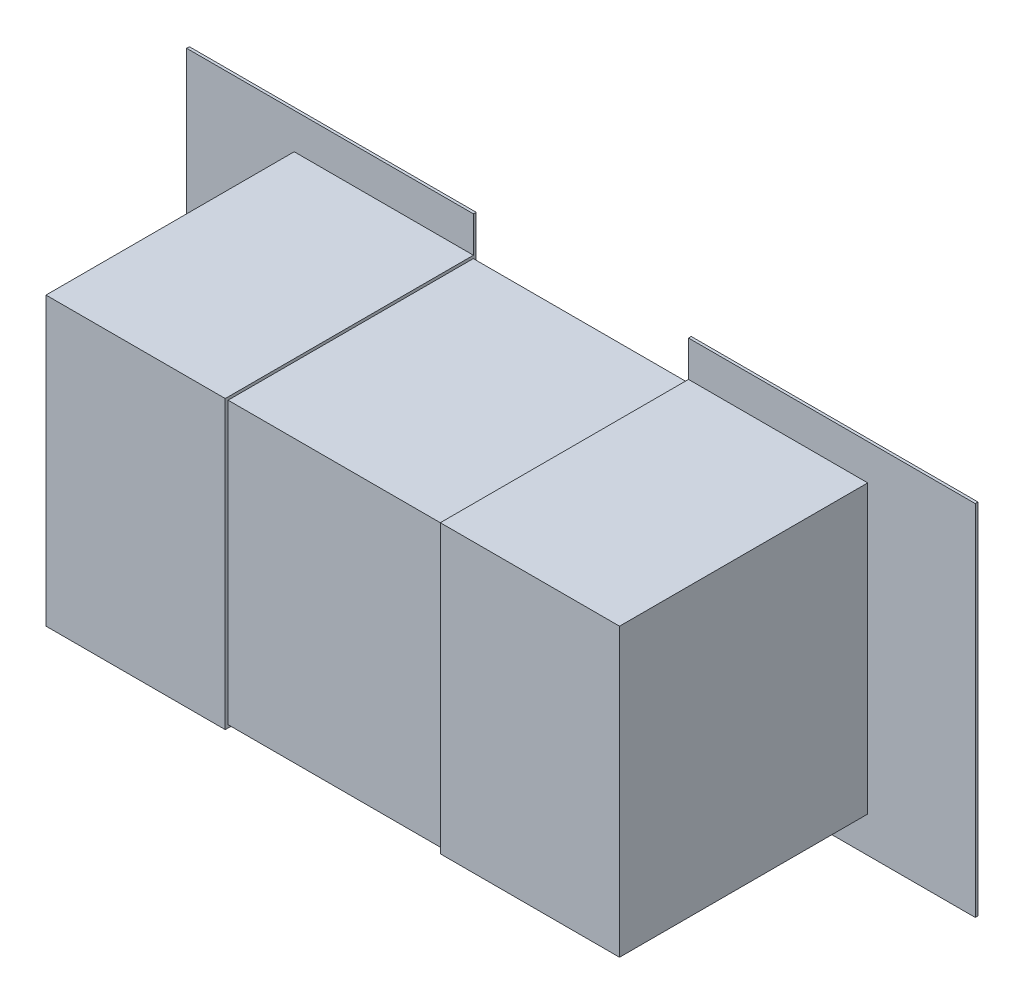
ISO-10303-21;
HEADER;
FILE_DESCRIPTION(('STEP AP214'),'2;1');
FILE_NAME('part.step','',(''),(''),'','','');
FILE_SCHEMA(('AUTOMOTIVE_DESIGN { 1 0 10303 214 1 1 1 1 }'));
ENDSEC;
DATA;
#1=APPLICATION_CONTEXT('core data for automotive mechanical design processes');
#2=APPLICATION_PROTOCOL_DEFINITION('international standard','automotive_design',2000,#1);
#3=PRODUCT_CONTEXT('',#1,'mechanical');
#4=PRODUCT('Part','Part','',(#3));
#5=PRODUCT_RELATED_PRODUCT_CATEGORY('part','',(#4));
#6=PRODUCT_DEFINITION_FORMATION('','',#4);
#7=PRODUCT_DEFINITION_CONTEXT('part definition',#1,'design');
#8=PRODUCT_DEFINITION('design','',#6,#7);
#9=PRODUCT_DEFINITION_SHAPE('','',#8);
#10=(LENGTH_UNIT() NAMED_UNIT(*) SI_UNIT(.MILLI.,.METRE.));
#11=(NAMED_UNIT(*) PLANE_ANGLE_UNIT() SI_UNIT($,.RADIAN.));
#12=(NAMED_UNIT(*) SI_UNIT($,.STERADIAN.) SOLID_ANGLE_UNIT());
#13=UNCERTAINTY_MEASURE_WITH_UNIT(LENGTH_MEASURE(1.E-05),#10,'distance_accuracy_value','');
#14=(GEOMETRIC_REPRESENTATION_CONTEXT(3) GLOBAL_UNCERTAINTY_ASSIGNED_CONTEXT((#13)) GLOBAL_UNIT_ASSIGNED_CONTEXT((#10,
#11,#12)) REPRESENTATION_CONTEXT('',''));
#15=CARTESIAN_POINT('',(0.,0.,0.));
#16=DIRECTION('',(0.,0.,1.));
#17=DIRECTION('',(1.,0.,0.));
#18=AXIS2_PLACEMENT_3D('',#15,#16,#17);
#19=CARTESIAN_POINT('',(0.800000000000102,-0.399999999999924,0.0762));
#20=DIRECTION('',(1.,0.,0.));
#21=DIRECTION('',(0.,0.,-1.));
#22=AXIS2_PLACEMENT_3D('',#19,#20,#21);
#23=PLANE('',#22);
#24=DIRECTION('',(0.,0.,-1.));
#25=VECTOR('',#24,1.);
#26=CARTESIAN_POINT('',(0.800000000000102,-0.399999999999924,0.0762));
#27=LINE('',#26,#25);
#28=CARTESIAN_POINT('',(0.800000000000102,-0.399999999999924,0.08382));
#29=VERTEX_POINT('',#28);
#30=CARTESIAN_POINT('',(0.800000000000102,-0.399999999999924,0.776224));
#31=VERTEX_POINT('',#30);
#32=EDGE_CURVE('E182',#29,#31,#27,.F.);
#33=ORIENTED_EDGE('',*,*,#32,.F.);
#34=DIRECTION('',(0.,1.,0.));
#35=VECTOR('',#34,1.);
#36=CARTESIAN_POINT('',(0.800000000000102,0.,0.08382));
#37=LINE('',#36,#35);
#38=CARTESIAN_POINT('',(0.800000000000102,0.399999999999924,0.08382));
#39=VERTEX_POINT('',#38);
#40=EDGE_CURVE('E192',#39,#29,#37,.F.);
#41=ORIENTED_EDGE('',*,*,#40,.F.);
#42=DIRECTION('',(0.,0.,1.));
#43=VECTOR('',#42,1.);
#44=CARTESIAN_POINT('',(0.800000000000102,0.399999999999924,0.0762));
#45=LINE('',#44,#43);
#46=CARTESIAN_POINT('',(0.800000000000102,0.399999999999924,0.776224));
#47=VERTEX_POINT('',#46);
#48=EDGE_CURVE('E175',#47,#39,#45,.F.);
#49=ORIENTED_EDGE('',*,*,#48,.F.);
#50=DIRECTION('',(0.,1.,0.));
#51=VECTOR('',#50,1.);
#52=CARTESIAN_POINT('',(0.800000000000102,0.,0.776224));
#53=LINE('',#52,#51);
#54=EDGE_CURVE('E150',#31,#47,#53,.T.);
#55=ORIENTED_EDGE('',*,*,#54,.F.);
#56=EDGE_LOOP('',(#33,#41,#49,#55));
#57=FACE_BOUND('',#56,.T.);
#58=ADVANCED_FACE('F17',(#57),#23,.T.);
#59=CARTESIAN_POINT('',(1.09999999999992,-0.500000000000032,0.0762));
#60=DIRECTION('',(1.,0.,0.));
#61=DIRECTION('',(0.,0.,-1.));
#62=AXIS2_PLACEMENT_3D('',#59,#60,#61);
#63=PLANE('',#62);
#64=DIRECTION('',(0.,0.,-1.));
#65=VECTOR('',#64,1.);
#66=CARTESIAN_POINT('',(1.09999999999992,-0.500000000000032,0.0762));
#67=LINE('',#66,#65);
#68=CARTESIAN_POINT('',(1.09999999999992,-0.500000000000032,0.0762));
#69=VERTEX_POINT('',#68);
#70=CARTESIAN_POINT('',(1.09999999999992,-0.500000000000032,0.08382));
#71=VERTEX_POINT('',#70);
#72=EDGE_CURVE('E168',#69,#71,#67,.F.);
#73=ORIENTED_EDGE('',*,*,#72,.F.);
#74=DIRECTION('',(0.,1.,0.));
#75=VECTOR('',#74,1.);
#76=CARTESIAN_POINT('',(1.09999999999992,0.,0.0762));
#77=LINE('',#76,#75);
#78=CARTESIAN_POINT('',(1.09999999999992,0.500000000000032,0.0762));
#79=VERTEX_POINT('',#78);
#80=EDGE_CURVE('E20',#69,#79,#77,.T.);
#81=ORIENTED_EDGE('',*,*,#80,.T.);
#82=DIRECTION('',(0.,0.,1.));
#83=VECTOR('',#82,1.);
#84=CARTESIAN_POINT('',(1.09999999999992,0.500000000000032,0.0762));
#85=LINE('',#84,#83);
#86=CARTESIAN_POINT('',(1.09999999999992,0.500000000000032,0.08382));
#87=VERTEX_POINT('',#86);
#88=EDGE_CURVE('E156',#87,#79,#85,.F.);
#89=ORIENTED_EDGE('',*,*,#88,.F.);
#90=DIRECTION('',(0.,1.,0.));
#91=VECTOR('',#90,1.);
#92=CARTESIAN_POINT('',(1.09999999999992,0.,0.08382));
#93=LINE('',#92,#91);
#94=EDGE_CURVE('E186',#71,#87,#93,.T.);
#95=ORIENTED_EDGE('',*,*,#94,.F.);
#96=EDGE_LOOP('',(#73,#81,#89,#95));
#97=FACE_BOUND('',#96,.T.);
#98=ADVANCED_FACE('F167',(#97),#63,.T.);
#99=CARTESIAN_POINT('',(0.,0.,0.0762));
#100=DIRECTION('',(0.,0.,1.));
#101=DIRECTION('',(1.,0.,0.));
#102=AXIS2_PLACEMENT_3D('',#99,#100,#101);
#103=PLANE('',#102);
#104=ORIENTED_EDGE('',*,*,#80,.F.);
#105=DIRECTION('',(1.,0.,0.));
#106=VECTOR('',#105,1.);
#107=CARTESIAN_POINT('',(0.30000000000007,-0.500000000000032,0.0762));
#108=LINE('',#107,#106);
#109=CARTESIAN_POINT('',(0.30000000000007,-0.500000000000032,0.0762));
#110=VERTEX_POINT('',#109);
#111=EDGE_CURVE('E199',#110,#69,#108,.T.);
#112=ORIENTED_EDGE('',*,*,#111,.F.);
#113=DIRECTION('',(0.,1.,0.));
#114=VECTOR('',#113,1.);
#115=CARTESIAN_POINT('',(0.30000000000007,-0.399999999999924,0.0762));
#116=LINE('',#115,#114);
#117=CARTESIAN_POINT('',(0.30000000000007,0.500000000000032,0.0762));
#118=VERTEX_POINT('',#117);
#119=EDGE_CURVE('E174',#110,#118,#116,.T.);
#120=ORIENTED_EDGE('',*,*,#119,.T.);
#121=DIRECTION('',(1.,0.,0.));
#122=VECTOR('',#121,1.);
#123=CARTESIAN_POINT('',(1.09999999999992,0.500000000000032,0.0762));
#124=LINE('',#123,#122);
#125=EDGE_CURVE('E161',#79,#118,#124,.F.);
#126=ORIENTED_EDGE('',*,*,#125,.F.);
#127=EDGE_LOOP('',(#104,#112,#120,#126));
#128=FACE_BOUND('',#127,.T.);
#129=ADVANCED_FACE('F173',(#128),#103,.F.);
#130=CARTESIAN_POINT('',(1.09999999999992,0.500000000000032,0.0762));
#131=DIRECTION('',(0.,1.,0.));
#132=DIRECTION('',(0.,0.,1.));
#133=AXIS2_PLACEMENT_3D('',#130,#131,#132);
#134=PLANE('',#133);
#135=ORIENTED_EDGE('',*,*,#88,.T.);
#136=ORIENTED_EDGE('',*,*,#125,.T.);
#137=DIRECTION('',(0.,0.,-1.));
#138=VECTOR('',#137,1.);
#139=CARTESIAN_POINT('',(0.30000000000007,0.500000000000032,0.0841999999999934));
#140=LINE('',#139,#138);
#141=CARTESIAN_POINT('',(0.30000000000007,0.500000000000032,0.08382));
#142=VERTEX_POINT('',#141);
#143=EDGE_CURVE('E202',#118,#142,#140,.F.);
#144=ORIENTED_EDGE('',*,*,#143,.T.);
#145=DIRECTION('',(1.,0.,0.));
#146=VECTOR('',#145,1.);
#147=CARTESIAN_POINT('',(0.,0.500000000000032,0.08382));
#148=LINE('',#147,#146);
#149=EDGE_CURVE('E163',#87,#142,#148,.F.);
#150=ORIENTED_EDGE('',*,*,#149,.F.);
#151=EDGE_LOOP('',(#135,#136,#144,#150));
#152=FACE_BOUND('',#151,.T.);
#153=ADVANCED_FACE('F158',(#152),#134,.T.);
#154=CARTESIAN_POINT('',(0.800000000000102,0.399999999999924,0.0762));
#155=DIRECTION('',(0.,1.,0.));
#156=DIRECTION('',(0.,0.,1.));
#157=AXIS2_PLACEMENT_3D('',#154,#155,#156);
#158=PLANE('',#157);
#159=ORIENTED_EDGE('',*,*,#48,.T.);
#160=DIRECTION('',(1.,0.,0.));
#161=VECTOR('',#160,1.);
#162=CARTESIAN_POINT('',(0.,0.399999999999924,0.08382));
#163=LINE('',#162,#161);
#164=CARTESIAN_POINT('',(0.30000000000007,0.399999999999924,0.08382));
#165=VERTEX_POINT('',#164);
#166=EDGE_CURVE('E189',#165,#39,#163,.T.);
#167=ORIENTED_EDGE('',*,*,#166,.F.);
#168=DIRECTION('',(0.,0.,-1.));
#169=VECTOR('',#168,1.);
#170=CARTESIAN_POINT('',(0.30000000000007,0.399999999999924,0.0841999999999934));
#171=LINE('',#170,#169);
#172=CARTESIAN_POINT('',(0.30000000000007,0.399999999999924,0.776224));
#173=VERTEX_POINT('',#172);
#174=EDGE_CURVE('E207',#165,#173,#171,.F.);
#175=ORIENTED_EDGE('',*,*,#174,.T.);
#176=DIRECTION('',(1.,0.,0.));
#177=VECTOR('',#176,1.);
#178=CARTESIAN_POINT('',(0.,0.399999999999924,0.776224));
#179=LINE('',#178,#177);
#180=EDGE_CURVE('E180',#47,#173,#179,.F.);
#181=ORIENTED_EDGE('',*,*,#180,.F.);
#182=EDGE_LOOP('',(#159,#167,#175,#181));
#183=FACE_BOUND('',#182,.T.);
#184=ADVANCED_FACE('F398',(#183),#158,.T.);
#185=CARTESIAN_POINT('',(0.,0.,0.776224));
#186=DIRECTION('',(0.,0.,1.));
#187=DIRECTION('',(1.,0.,0.));
#188=AXIS2_PLACEMENT_3D('',#185,#186,#187);
#189=PLANE('',#188);
#190=ORIENTED_EDGE('',*,*,#180,.T.);
#191=DIRECTION('',(0.,1.,0.));
#192=VECTOR('',#191,1.);
#193=CARTESIAN_POINT('',(0.30000000000007,-0.399999999999924,0.776224));
#194=LINE('',#193,#192);
#195=CARTESIAN_POINT('',(0.30000000000007,-0.399999999999924,0.776224));
#196=VERTEX_POINT('',#195);
#197=EDGE_CURVE('E210',#173,#196,#194,.F.);
#198=ORIENTED_EDGE('',*,*,#197,.T.);
#199=DIRECTION('',(1.,0.,0.));
#200=VECTOR('',#199,1.);
#201=CARTESIAN_POINT('',(-0.800000000000102,-0.399999999999924,0.776224));
#202=LINE('',#201,#200);
#203=EDGE_CURVE('E184',#31,#196,#202,.F.);
#204=ORIENTED_EDGE('',*,*,#203,.F.);
#205=ORIENTED_EDGE('',*,*,#54,.T.);
#206=EDGE_LOOP('',(#190,#198,#204,#205));
#207=FACE_BOUND('',#206,.T.);
#208=ADVANCED_FACE('F394',(#207),#189,.T.);
#209=CARTESIAN_POINT('',(-0.800000000000102,-0.399999999999924,0.0762));
#210=DIRECTION('',(0.,-1.,0.));
#211=DIRECTION('',(0.,0.,-1.));
#212=AXIS2_PLACEMENT_3D('',#209,#210,#211);
#213=PLANE('',#212);
#214=DIRECTION('',(0.,0.,-1.));
#215=VECTOR('',#214,1.);
#216=CARTESIAN_POINT('',(0.30000000000007,-0.399999999999924,0.0841999999999934));
#217=LINE('',#216,#215);
#218=CARTESIAN_POINT('',(0.30000000000007,-0.399999999999924,0.08382));
#219=VERTEX_POINT('',#218);
#220=EDGE_CURVE('E213',#196,#219,#217,.T.);
#221=ORIENTED_EDGE('',*,*,#220,.T.);
#222=DIRECTION('',(1.,0.,0.));
#223=VECTOR('',#222,1.);
#224=CARTESIAN_POINT('',(0.,-0.399999999999924,0.08382));
#225=LINE('',#224,#223);
#226=EDGE_CURVE('E194',#29,#219,#225,.F.);
#227=ORIENTED_EDGE('',*,*,#226,.F.);
#228=ORIENTED_EDGE('',*,*,#32,.T.);
#229=ORIENTED_EDGE('',*,*,#203,.T.);
#230=EDGE_LOOP('',(#221,#227,#228,#229));
#231=FACE_BOUND('',#230,.T.);
#232=ADVANCED_FACE('F390',(#231),#213,.T.);
#233=CARTESIAN_POINT('',(0.,0.,0.08382));
#234=DIRECTION('',(0.,0.,1.));
#235=DIRECTION('',(1.,0.,0.));
#236=AXIS2_PLACEMENT_3D('',#233,#234,#235);
#237=PLANE('',#236);
#238=ORIENTED_EDGE('',*,*,#40,.T.);
#239=ORIENTED_EDGE('',*,*,#226,.T.);
#240=DIRECTION('',(0.,1.,0.));
#241=VECTOR('',#240,1.);
#242=CARTESIAN_POINT('',(0.30000000000007,-0.399999999999924,0.08382));
#243=LINE('',#242,#241);
#244=CARTESIAN_POINT('',(0.30000000000007,-0.500000000000032,0.08382));
#245=VERTEX_POINT('',#244);
#246=EDGE_CURVE('E216',#219,#245,#243,.F.);
#247=ORIENTED_EDGE('',*,*,#246,.T.);
#248=DIRECTION('',(1.,0.,0.));
#249=VECTOR('',#248,1.);
#250=CARTESIAN_POINT('',(0.30000000000007,-0.500000000000032,0.08382));
#251=LINE('',#250,#249);
#252=EDGE_CURVE('E197',#71,#245,#251,.F.);
#253=ORIENTED_EDGE('',*,*,#252,.F.);
#254=ORIENTED_EDGE('',*,*,#94,.T.);
#255=ORIENTED_EDGE('',*,*,#149,.T.);
#256=DIRECTION('',(0.,1.,0.));
#257=VECTOR('',#256,1.);
#258=CARTESIAN_POINT('',(0.30000000000007,-0.399999999999924,0.08382));
#259=LINE('',#258,#257);
#260=EDGE_CURVE('E204',#142,#165,#259,.F.);
#261=ORIENTED_EDGE('',*,*,#260,.T.);
#262=ORIENTED_EDGE('',*,*,#166,.T.);
#263=EDGE_LOOP('',(#238,#239,#247,#253,#254,#255,#261,#262));
#264=FACE_BOUND('',#263,.T.);
#265=ADVANCED_FACE('F386',(#264),#237,.T.);
#266=CARTESIAN_POINT('',(0.30000000000007,-0.500000000000032,0.0762));
#267=DIRECTION('',(0.,-1.,0.));
#268=DIRECTION('',(0.,0.,-1.));
#269=AXIS2_PLACEMENT_3D('',#266,#267,#268);
#270=PLANE('',#269);
#271=DIRECTION('',(0.,0.,-1.));
#272=VECTOR('',#271,1.);
#273=CARTESIAN_POINT('',(0.30000000000007,-0.500000000000032,0.0841999999999934));
#274=LINE('',#273,#272);
#275=EDGE_CURVE('E219',#245,#110,#274,.T.);
#276=ORIENTED_EDGE('',*,*,#275,.T.);
#277=ORIENTED_EDGE('',*,*,#111,.T.);
#278=ORIENTED_EDGE('',*,*,#72,.T.);
#279=ORIENTED_EDGE('',*,*,#252,.T.);
#280=EDGE_LOOP('',(#276,#277,#278,#279));
#281=FACE_BOUND('',#280,.T.);
#282=ADVANCED_FACE('F382',(#281),#270,.T.);
#283=CARTESIAN_POINT('',(0.30000000000007,-0.399999999999924,0.0841999999999934));
#284=DIRECTION('',(1.,0.,0.));
#285=DIRECTION('',(0.,0.,-1.));
#286=AXIS2_PLACEMENT_3D('',#283,#284,#285);
#287=PLANE('',#286);
#288=DIRECTION('',(0.,1.,0.));
#289=VECTOR('',#288,1.);
#290=CARTESIAN_POINT('',(0.30000000000007,0.399999999999924,0.768224000000032));
#291=LINE('',#290,#289);
#292=CARTESIAN_POINT('',(0.30000000000007,0.391999999999956,0.768224000000032));
#293=VERTEX_POINT('',#292);
#294=CARTESIAN_POINT('',(0.30000000000007,-0.391999999999956,0.768224000000032));
#295=VERTEX_POINT('',#294);
#296=EDGE_CURVE('E248',#293,#295,#291,.F.);
#297=ORIENTED_EDGE('',*,*,#296,.T.);
#298=DIRECTION('',(0.,0.,1.));
#299=VECTOR('',#298,1.);
#300=CARTESIAN_POINT('',(0.30000000000007,-0.391999999999956,0.776224));
#301=LINE('',#300,#299);
#302=CARTESIAN_POINT('',(0.30000000000007,-0.391999999999956,0.0841999999999934));
#303=VERTEX_POINT('',#302);
#304=EDGE_CURVE('E233',#295,#303,#301,.F.);
#305=ORIENTED_EDGE('',*,*,#304,.T.);
#306=DIRECTION('',(0.,1.,0.));
#307=VECTOR('',#306,1.);
#308=CARTESIAN_POINT('',(0.30000000000007,-0.399999999999924,0.0841999999999934));
#309=LINE('',#308,#307);
#310=CARTESIAN_POINT('',(0.30000000000007,0.391999999999956,0.0841999999999934));
#311=VERTEX_POINT('',#310);
#312=EDGE_CURVE('E238',#303,#311,#309,.T.);
#313=ORIENTED_EDGE('',*,*,#312,.T.);
#314=DIRECTION('',(0.,0.,-1.));
#315=VECTOR('',#314,1.);
#316=CARTESIAN_POINT('',(0.30000000000007,0.391999999999956,0.0762));
#317=LINE('',#316,#315);
#318=EDGE_CURVE('E243',#311,#293,#317,.F.);
#319=ORIENTED_EDGE('',*,*,#318,.T.);
#320=EDGE_LOOP('',(#297,#305,#313,#319));
#321=FACE_BOUND('',#320,.T.);
#322=ORIENTED_EDGE('',*,*,#246,.F.);
#323=ORIENTED_EDGE('',*,*,#220,.F.);
#324=ORIENTED_EDGE('',*,*,#197,.F.);
#325=ORIENTED_EDGE('',*,*,#174,.F.);
#326=ORIENTED_EDGE('',*,*,#260,.F.);
#327=ORIENTED_EDGE('',*,*,#143,.F.);
#328=ORIENTED_EDGE('',*,*,#119,.F.);
#329=ORIENTED_EDGE('',*,*,#275,.F.);
#330=EDGE_LOOP('',(#322,#323,#324,#325,#326,#327,#328,#329));
#331=FACE_BOUND('',#330,.T.);
#332=ADVANCED_FACE('F378',(#321,#331),#287,.F.);
#333=CARTESIAN_POINT('',(-0.800000000000102,0.399999999999924,0.0762));
#334=DIRECTION('',(-1.,0.,0.));
#335=DIRECTION('',(0.,0.,1.));
#336=AXIS2_PLACEMENT_3D('',#333,#334,#335);
#337=PLANE('',#336);
#338=DIRECTION('',(0.,0.,1.));
#339=VECTOR('',#338,1.);
#340=CARTESIAN_POINT('',(-0.800000000000102,0.399999999999924,0.0762));
#341=LINE('',#340,#339);
#342=CARTESIAN_POINT('',(-0.800000000000102,0.399999999999924,0.08382));
#343=VERTEX_POINT('',#342);
#344=CARTESIAN_POINT('',(-0.800000000000102,0.399999999999924,0.776224));
#345=VERTEX_POINT('',#344);
#346=EDGE_CURVE('E222',#343,#345,#341,.T.);
#347=ORIENTED_EDGE('',*,*,#346,.F.);
#348=DIRECTION('',(0.,1.,0.));
#349=VECTOR('',#348,1.);
#350=CARTESIAN_POINT('',(-0.800000000000102,0.,0.08382));
#351=LINE('',#350,#349);
#352=CARTESIAN_POINT('',(-0.800000000000102,-0.399999999999924,0.08382));
#353=VERTEX_POINT('',#352);
#354=EDGE_CURVE('E259',#353,#343,#351,.T.);
#355=ORIENTED_EDGE('',*,*,#354,.F.);
#356=DIRECTION('',(0.,0.,-1.));
#357=VECTOR('',#356,1.);
#358=CARTESIAN_POINT('',(-0.800000000000102,-0.399999999999924,0.0762));
#359=LINE('',#358,#357);
#360=CARTESIAN_POINT('',(-0.800000000000102,-0.399999999999924,0.776224));
#361=VERTEX_POINT('',#360);
#362=EDGE_CURVE('E224',#361,#353,#359,.T.);
#363=ORIENTED_EDGE('',*,*,#362,.F.);
#364=DIRECTION('',(0.,1.,0.));
#365=VECTOR('',#364,1.);
#366=CARTESIAN_POINT('',(-0.800000000000102,0.,0.776224));
#367=LINE('',#366,#365);
#368=EDGE_CURVE('E229',#345,#361,#367,.F.);
#369=ORIENTED_EDGE('',*,*,#368,.F.);
#370=EDGE_LOOP('',(#347,#355,#363,#369));
#371=FACE_BOUND('',#370,.T.);
#372=ADVANCED_FACE('F374',(#371),#337,.T.);
#373=CARTESIAN_POINT('',(0.800000000000102,0.399999999999924,0.0762));
#374=DIRECTION('',(0.,1.,0.));
#375=DIRECTION('',(0.,0.,1.));
#376=AXIS2_PLACEMENT_3D('',#373,#374,#375);
#377=PLANE('',#376);
#378=DIRECTION('',(0.,0.,1.));
#379=VECTOR('',#378,1.);
#380=CARTESIAN_POINT('',(-0.30000000000007,0.399999999999924,0.0762));
#381=LINE('',#380,#379);
#382=CARTESIAN_POINT('',(-0.30000000000007,0.399999999999924,0.776224));
#383=VERTEX_POINT('',#382);
#384=CARTESIAN_POINT('',(-0.30000000000007,0.399999999999924,0.08382));
#385=VERTEX_POINT('',#384);
#386=EDGE_CURVE('E262',#383,#385,#381,.F.);
#387=ORIENTED_EDGE('',*,*,#386,.T.);
#388=DIRECTION('',(1.,0.,0.));
#389=VECTOR('',#388,1.);
#390=CARTESIAN_POINT('',(0.,0.399999999999924,0.08382));
#391=LINE('',#390,#389);
#392=EDGE_CURVE('E254',#343,#385,#391,.T.);
#393=ORIENTED_EDGE('',*,*,#392,.F.);
#394=ORIENTED_EDGE('',*,*,#346,.T.);
#395=DIRECTION('',(1.,0.,0.));
#396=VECTOR('',#395,1.);
#397=CARTESIAN_POINT('',(0.,0.399999999999924,0.776224));
#398=LINE('',#397,#396);
#399=EDGE_CURVE('E226',#383,#345,#398,.F.);
#400=ORIENTED_EDGE('',*,*,#399,.F.);
#401=EDGE_LOOP('',(#387,#393,#394,#400));
#402=FACE_BOUND('',#401,.T.);
#403=ADVANCED_FACE('F370',(#402),#377,.T.);
#404=CARTESIAN_POINT('',(-0.800000000000102,-0.399999999999924,0.0762));
#405=DIRECTION('',(0.,-1.,0.));
#406=DIRECTION('',(0.,0.,-1.));
#407=AXIS2_PLACEMENT_3D('',#404,#405,#406);
#408=PLANE('',#407);
#409=ORIENTED_EDGE('',*,*,#362,.T.);
#410=DIRECTION('',(1.,0.,0.));
#411=VECTOR('',#410,1.);
#412=CARTESIAN_POINT('',(0.,-0.399999999999924,0.08382));
#413=LINE('',#412,#411);
#414=CARTESIAN_POINT('',(-0.30000000000007,-0.399999999999924,0.08382));
#415=VERTEX_POINT('',#414);
#416=EDGE_CURVE('E256',#415,#353,#413,.F.);
#417=ORIENTED_EDGE('',*,*,#416,.F.);
#418=DIRECTION('',(0.,0.,1.));
#419=VECTOR('',#418,1.);
#420=CARTESIAN_POINT('',(-0.30000000000007,-0.399999999999924,0.0762));
#421=LINE('',#420,#419);
#422=CARTESIAN_POINT('',(-0.30000000000007,-0.399999999999924,0.776224));
#423=VERTEX_POINT('',#422);
#424=EDGE_CURVE('E271',#415,#423,#421,.T.);
#425=ORIENTED_EDGE('',*,*,#424,.T.);
#426=DIRECTION('',(1.,0.,0.));
#427=VECTOR('',#426,1.);
#428=CARTESIAN_POINT('',(0.,-0.399999999999924,0.776224));
#429=LINE('',#428,#427);
#430=EDGE_CURVE('E231',#361,#423,#429,.T.);
#431=ORIENTED_EDGE('',*,*,#430,.F.);
#432=EDGE_LOOP('',(#409,#417,#425,#431));
#433=FACE_BOUND('',#432,.T.);
#434=ADVANCED_FACE('F366',(#433),#408,.T.);
#435=CARTESIAN_POINT('',(0.,0.,0.776224));
#436=DIRECTION('',(0.,0.,1.));
#437=DIRECTION('',(1.,0.,0.));
#438=AXIS2_PLACEMENT_3D('',#435,#436,#437);
#439=PLANE('',#438);
#440=ORIENTED_EDGE('',*,*,#430,.T.);
#441=DIRECTION('',(0.,1.,0.));
#442=VECTOR('',#441,1.);
#443=CARTESIAN_POINT('',(-0.30000000000007,-0.399999999999924,0.776224));
#444=LINE('',#443,#442);
#445=EDGE_CURVE('E274',#423,#383,#444,.T.);
#446=ORIENTED_EDGE('',*,*,#445,.T.);
#447=ORIENTED_EDGE('',*,*,#399,.T.);
#448=ORIENTED_EDGE('',*,*,#368,.T.);
#449=EDGE_LOOP('',(#440,#446,#447,#448));
#450=FACE_BOUND('',#449,.T.);
#451=ADVANCED_FACE('F362',(#450),#439,.T.);
#452=CARTESIAN_POINT('',(-0.30000000000007,-0.391999999999956,0.776224));
#453=DIRECTION('',(0.,1.,0.));
#454=DIRECTION('',(0.,0.,1.));
#455=AXIS2_PLACEMENT_3D('',#452,#453,#454);
#456=PLANE('',#455);
#457=DIRECTION('',(1.,0.,0.));
#458=VECTOR('',#457,1.);
#459=CARTESIAN_POINT('',(-0.30000000000007,-0.391999999999956,0.0841999999999934));
#460=LINE('',#459,#458);
#461=CARTESIAN_POINT('',(-0.30000000000007,-0.391999999999956,0.0841999999999934));
#462=VERTEX_POINT('',#461);
#463=EDGE_CURVE('E235',#462,#303,#460,.T.);
#464=ORIENTED_EDGE('',*,*,#463,.T.);
#465=ORIENTED_EDGE('',*,*,#304,.F.);
#466=DIRECTION('',(-1.,0.,0.));
#467=VECTOR('',#466,1.);
#468=CARTESIAN_POINT('',(-0.30000000000007,-0.391999999999956,0.768224000000032));
#469=LINE('',#468,#467);
#470=CARTESIAN_POINT('',(-0.30000000000007,-0.391999999999956,0.768224000000032));
#471=VERTEX_POINT('',#470);
#472=EDGE_CURVE('E251',#295,#471,#469,.T.);
#473=ORIENTED_EDGE('',*,*,#472,.T.);
#474=DIRECTION('',(0.,0.,1.));
#475=VECTOR('',#474,1.);
#476=CARTESIAN_POINT('',(-0.30000000000007,-0.391999999999956,0.0762));
#477=LINE('',#476,#475);
#478=EDGE_CURVE('E277',#471,#462,#477,.F.);
#479=ORIENTED_EDGE('',*,*,#478,.T.);
#480=EDGE_LOOP('',(#464,#465,#473,#479));
#481=FACE_BOUND('',#480,.T.);
#482=ADVANCED_FACE('F358',(#481),#456,.F.);
#483=CARTESIAN_POINT('',(-0.30000000000007,-0.399999999999924,0.0841999999999934));
#484=DIRECTION('',(0.,0.,1.));
#485=DIRECTION('',(1.,0.,0.));
#486=AXIS2_PLACEMENT_3D('',#483,#484,#485);
#487=PLANE('',#486);
#488=DIRECTION('',(1.,0.,0.));
#489=VECTOR('',#488,1.);
#490=CARTESIAN_POINT('',(-0.30000000000007,0.391999999999956,0.0841999999999934));
#491=LINE('',#490,#489);
#492=CARTESIAN_POINT('',(-0.30000000000007,0.391999999999956,0.0841999999999934));
#493=VERTEX_POINT('',#492);
#494=EDGE_CURVE('E240',#493,#311,#491,.T.);
#495=ORIENTED_EDGE('',*,*,#494,.T.);
#496=ORIENTED_EDGE('',*,*,#312,.F.);
#497=ORIENTED_EDGE('',*,*,#463,.F.);
#498=DIRECTION('',(0.,1.,0.));
#499=VECTOR('',#498,1.);
#500=CARTESIAN_POINT('',(-0.30000000000007,-0.399999999999924,0.0841999999999934));
#501=LINE('',#500,#499);
#502=EDGE_CURVE('E280',#462,#493,#501,.T.);
#503=ORIENTED_EDGE('',*,*,#502,.T.);
#504=EDGE_LOOP('',(#495,#496,#497,#503));
#505=FACE_BOUND('',#504,.T.);
#506=ADVANCED_FACE('F354',(#505),#487,.F.);
#507=CARTESIAN_POINT('',(-0.30000000000007,0.391999999999956,0.0762));
#508=DIRECTION('',(0.,-1.,0.));
#509=DIRECTION('',(0.,0.,-1.));
#510=AXIS2_PLACEMENT_3D('',#507,#508,#509);
#511=PLANE('',#510);
#512=DIRECTION('',(-1.,0.,0.));
#513=VECTOR('',#512,1.);
#514=CARTESIAN_POINT('',(-0.30000000000007,0.391999999999956,0.768224000000032));
#515=LINE('',#514,#513);
#516=CARTESIAN_POINT('',(-0.30000000000007,0.391999999999956,0.768224000000032));
#517=VERTEX_POINT('',#516);
#518=EDGE_CURVE('E245',#517,#293,#515,.F.);
#519=ORIENTED_EDGE('',*,*,#518,.T.);
#520=ORIENTED_EDGE('',*,*,#318,.F.);
#521=ORIENTED_EDGE('',*,*,#494,.F.);
#522=DIRECTION('',(0.,0.,1.));
#523=VECTOR('',#522,1.);
#524=CARTESIAN_POINT('',(-0.30000000000007,0.391999999999956,0.0762));
#525=LINE('',#524,#523);
#526=EDGE_CURVE('E283',#493,#517,#525,.T.);
#527=ORIENTED_EDGE('',*,*,#526,.T.);
#528=EDGE_LOOP('',(#519,#520,#521,#527));
#529=FACE_BOUND('',#528,.T.);
#530=ADVANCED_FACE('F350',(#529),#511,.F.);
#531=CARTESIAN_POINT('',(-0.30000000000007,0.399999999999924,0.768224000000032));
#532=DIRECTION('',(0.,0.,-1.));
#533=DIRECTION('',(-1.,0.,0.));
#534=AXIS2_PLACEMENT_3D('',#531,#532,#533);
#535=PLANE('',#534);
#536=ORIENTED_EDGE('',*,*,#472,.F.);
#537=ORIENTED_EDGE('',*,*,#296,.F.);
#538=ORIENTED_EDGE('',*,*,#518,.F.);
#539=DIRECTION('',(0.,1.,0.));
#540=VECTOR('',#539,1.);
#541=CARTESIAN_POINT('',(-0.30000000000007,-0.399999999999924,0.768224000000032));
#542=LINE('',#541,#540);
#543=EDGE_CURVE('E286',#517,#471,#542,.F.);
#544=ORIENTED_EDGE('',*,*,#543,.T.);
#545=EDGE_LOOP('',(#536,#537,#538,#544));
#546=FACE_BOUND('',#545,.T.);
#547=ADVANCED_FACE('F346',(#546),#535,.F.);
#548=CARTESIAN_POINT('',(0.,0.,0.08382));
#549=DIRECTION('',(0.,0.,1.));
#550=DIRECTION('',(1.,0.,0.));
#551=AXIS2_PLACEMENT_3D('',#548,#549,#550);
#552=PLANE('',#551);
#553=ORIENTED_EDGE('',*,*,#416,.T.);
#554=ORIENTED_EDGE('',*,*,#354,.T.);
#555=ORIENTED_EDGE('',*,*,#392,.T.);
#556=DIRECTION('',(0.,1.,0.));
#557=VECTOR('',#556,1.);
#558=CARTESIAN_POINT('',(-0.30000000000007,-0.399999999999924,0.08382));
#559=LINE('',#558,#557);
#560=CARTESIAN_POINT('',(-0.30000000000007,0.500000000000032,0.08382));
#561=VERTEX_POINT('',#560);
#562=EDGE_CURVE('E265',#385,#561,#559,.T.);
#563=ORIENTED_EDGE('',*,*,#562,.T.);
#564=DIRECTION('',(1.,0.,0.));
#565=VECTOR('',#564,1.);
#566=CARTESIAN_POINT('',(-0.30000000000007,0.500000000000032,0.08382));
#567=LINE('',#566,#565);
#568=CARTESIAN_POINT('',(-1.09999999999992,0.500000000000032,0.08382));
#569=VERTEX_POINT('',#568);
#570=EDGE_CURVE('E289',#569,#561,#567,.T.);
#571=ORIENTED_EDGE('',*,*,#570,.F.);
#572=DIRECTION('',(0.,1.,0.));
#573=VECTOR('',#572,1.);
#574=CARTESIAN_POINT('',(-1.09999999999992,0.500000000000032,0.08382));
#575=LINE('',#574,#573);
#576=CARTESIAN_POINT('',(-1.09999999999992,-0.500000000000032,0.08382));
#577=VERTEX_POINT('',#576);
#578=EDGE_CURVE('E293',#577,#569,#575,.T.);
#579=ORIENTED_EDGE('',*,*,#578,.F.);
#580=DIRECTION('',(1.,0.,0.));
#581=VECTOR('',#580,1.);
#582=CARTESIAN_POINT('',(-1.09999999999992,-0.500000000000032,0.08382));
#583=LINE('',#582,#581);
#584=CARTESIAN_POINT('',(-0.30000000000007,-0.500000000000032,0.08382));
#585=VERTEX_POINT('',#584);
#586=EDGE_CURVE('E300',#585,#577,#583,.F.);
#587=ORIENTED_EDGE('',*,*,#586,.F.);
#588=DIRECTION('',(0.,1.,0.));
#589=VECTOR('',#588,1.);
#590=CARTESIAN_POINT('',(-0.30000000000007,-0.399999999999924,0.08382));
#591=LINE('',#590,#589);
#592=EDGE_CURVE('E268',#585,#415,#591,.T.);
#593=ORIENTED_EDGE('',*,*,#592,.T.);
#594=EDGE_LOOP('',(#553,#554,#555,#563,#571,#579,#587,#593));
#595=FACE_BOUND('',#594,.T.);
#596=ADVANCED_FACE('F342',(#595),#552,.T.);
#597=CARTESIAN_POINT('',(-0.30000000000007,-0.399999999999924,0.0762));
#598=DIRECTION('',(-1.,0.,0.));
#599=DIRECTION('',(0.,0.,1.));
#600=AXIS2_PLACEMENT_3D('',#597,#598,#599);
#601=PLANE('',#600);
#602=ORIENTED_EDGE('',*,*,#526,.F.);
#603=ORIENTED_EDGE('',*,*,#502,.F.);
#604=ORIENTED_EDGE('',*,*,#478,.F.);
#605=ORIENTED_EDGE('',*,*,#543,.F.);
#606=EDGE_LOOP('',(#602,#603,#604,#605));
#607=FACE_BOUND('',#606,.T.);
#608=ORIENTED_EDGE('',*,*,#424,.F.);
#609=ORIENTED_EDGE('',*,*,#592,.F.);
#610=DIRECTION('',(0.,0.,-1.));
#611=VECTOR('',#610,1.);
#612=CARTESIAN_POINT('',(-0.30000000000007,-0.500000000000032,0.0762));
#613=LINE('',#612,#611);
#614=CARTESIAN_POINT('',(-0.30000000000007,-0.500000000000032,0.0762));
#615=VERTEX_POINT('',#614);
#616=EDGE_CURVE('E297',#615,#585,#613,.F.);
#617=ORIENTED_EDGE('',*,*,#616,.F.);
#618=DIRECTION('',(0.,1.,0.));
#619=VECTOR('',#618,1.);
#620=CARTESIAN_POINT('',(-0.30000000000007,0.,0.0762));
#621=LINE('',#620,#619);
#622=CARTESIAN_POINT('',(-0.30000000000007,0.500000000000032,0.0762));
#623=VERTEX_POINT('',#622);
#624=EDGE_CURVE('E303',#615,#623,#621,.T.);
#625=ORIENTED_EDGE('',*,*,#624,.T.);
#626=DIRECTION('',(0.,0.,1.));
#627=VECTOR('',#626,1.);
#628=CARTESIAN_POINT('',(-0.30000000000007,0.500000000000032,0.0762));
#629=LINE('',#628,#627);
#630=EDGE_CURVE('E291',#561,#623,#629,.F.);
#631=ORIENTED_EDGE('',*,*,#630,.F.);
#632=ORIENTED_EDGE('',*,*,#562,.F.);
#633=ORIENTED_EDGE('',*,*,#386,.F.);
#634=ORIENTED_EDGE('',*,*,#445,.F.);
#635=EDGE_LOOP('',(#608,#609,#617,#625,#631,#632,#633,#634));
#636=FACE_BOUND('',#635,.T.);
#637=ADVANCED_FACE('F324',(#607,#636),#601,.F.);
#638=CARTESIAN_POINT('',(-0.30000000000007,0.500000000000032,0.0762));
#639=DIRECTION('',(0.,1.,0.));
#640=DIRECTION('',(0.,0.,1.));
#641=AXIS2_PLACEMENT_3D('',#638,#639,#640);
#642=PLANE('',#641);
#643=ORIENTED_EDGE('',*,*,#630,.T.);
#644=DIRECTION('',(1.,0.,0.));
#645=VECTOR('',#644,1.);
#646=CARTESIAN_POINT('',(0.,0.500000000000032,0.0762));
#647=LINE('',#646,#645);
#648=CARTESIAN_POINT('',(-1.09999999999992,0.500000000000032,0.0762));
#649=VERTEX_POINT('',#648);
#650=EDGE_CURVE('E306',#623,#649,#647,.F.);
#651=ORIENTED_EDGE('',*,*,#650,.T.);
#652=DIRECTION('',(0.,0.,1.));
#653=VECTOR('',#652,1.);
#654=CARTESIAN_POINT('',(-1.09999999999992,0.500000000000032,0.0762));
#655=LINE('',#654,#653);
#656=EDGE_CURVE('E295',#569,#649,#655,.F.);
#657=ORIENTED_EDGE('',*,*,#656,.F.);
#658=ORIENTED_EDGE('',*,*,#570,.T.);
#659=EDGE_LOOP('',(#643,#651,#657,#658));
#660=FACE_BOUND('',#659,.T.);
#661=ADVANCED_FACE('F318',(#660),#642,.T.);
#662=CARTESIAN_POINT('',(-1.09999999999992,0.500000000000032,0.0762));
#663=DIRECTION('',(-1.,0.,0.));
#664=DIRECTION('',(0.,0.,1.));
#665=AXIS2_PLACEMENT_3D('',#662,#663,#664);
#666=PLANE('',#665);
#667=ORIENTED_EDGE('',*,*,#656,.T.);
#668=DIRECTION('',(0.,1.,0.));
#669=VECTOR('',#668,1.);
#670=CARTESIAN_POINT('',(-1.09999999999992,0.,0.0762));
#671=LINE('',#670,#669);
#672=CARTESIAN_POINT('',(-1.09999999999992,-0.500000000000032,0.0762));
#673=VERTEX_POINT('',#672);
#674=EDGE_CURVE('E26',#649,#673,#671,.F.);
#675=ORIENTED_EDGE('',*,*,#674,.T.);
#676=DIRECTION('',(0.,0.,-1.));
#677=VECTOR('',#676,1.);
#678=CARTESIAN_POINT('',(-1.09999999999992,-0.500000000000032,0.0762));
#679=LINE('',#678,#677);
#680=EDGE_CURVE('E34',#577,#673,#679,.T.);
#681=ORIENTED_EDGE('',*,*,#680,.F.);
#682=ORIENTED_EDGE('',*,*,#578,.T.);
#683=EDGE_LOOP('',(#667,#675,#681,#682));
#684=FACE_BOUND('',#683,.T.);
#685=ADVANCED_FACE('F312',(#684),#666,.T.);
#686=CARTESIAN_POINT('',(-1.09999999999992,-0.500000000000032,0.0762));
#687=DIRECTION('',(0.,-1.,0.));
#688=DIRECTION('',(0.,0.,-1.));
#689=AXIS2_PLACEMENT_3D('',#686,#687,#688);
#690=PLANE('',#689);
#691=ORIENTED_EDGE('',*,*,#680,.T.);
#692=DIRECTION('',(1.,0.,0.));
#693=VECTOR('',#692,1.);
#694=CARTESIAN_POINT('',(0.,-0.500000000000032,0.0762));
#695=LINE('',#694,#693);
#696=EDGE_CURVE('E11',#673,#615,#695,.T.);
#697=ORIENTED_EDGE('',*,*,#696,.T.);
#698=ORIENTED_EDGE('',*,*,#616,.T.);
#699=ORIENTED_EDGE('',*,*,#586,.T.);
#700=EDGE_LOOP('',(#691,#697,#698,#699));
#701=FACE_BOUND('',#700,.T.);
#702=ADVANCED_FACE('F327',(#701),#690,.T.);
#703=CARTESIAN_POINT('',(0.,0.,0.0762));
#704=DIRECTION('',(0.,0.,1.));
#705=DIRECTION('',(1.,0.,0.));
#706=AXIS2_PLACEMENT_3D('',#703,#704,#705);
#707=PLANE('',#706);
#708=ORIENTED_EDGE('',*,*,#674,.F.);
#709=ORIENTED_EDGE('',*,*,#650,.F.);
#710=ORIENTED_EDGE('',*,*,#624,.F.);
#711=ORIENTED_EDGE('',*,*,#696,.F.);
#712=EDGE_LOOP('',(#708,#709,#710,#711));
#713=FACE_BOUND('',#712,.T.);
#714=ADVANCED_FACE('F316',(#713),#707,.F.);
#715=CLOSED_SHELL('',(#58,#98,#129,#153,#184,#208,#232,#265,#282,#332,#372,#403,#434,#451,#482,
#506,#530,#547,#596,#637,#661,#685,#702,#714));
#716=MANIFOLD_SOLID_BREP('B1',#715);
#717=ADVANCED_BREP_SHAPE_REPRESENTATION('',(#18,#716),#14);
#718=SHAPE_DEFINITION_REPRESENTATION(#9,#717);
ENDSEC;
END-ISO-10303-21;
